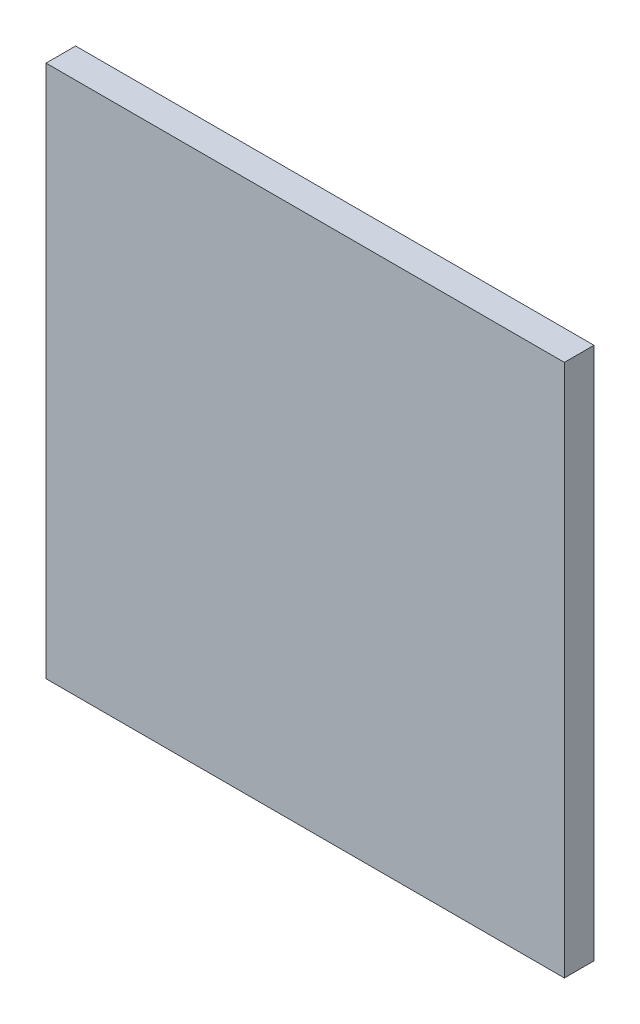
ISO-10303-21;
HEADER;
FILE_DESCRIPTION(('STEP AP214'),'2;1');
FILE_NAME('part.step','',(''),(''),'','','');
FILE_SCHEMA(('AUTOMOTIVE_DESIGN { 1 0 10303 214 1 1 1 1 }'));
ENDSEC;
DATA;
#1=APPLICATION_CONTEXT('core data for automotive mechanical design processes');
#2=APPLICATION_PROTOCOL_DEFINITION('international standard','automotive_design',2000,#1);
#3=PRODUCT_CONTEXT('',#1,'mechanical');
#4=PRODUCT('Part','Part','',(#3));
#5=PRODUCT_RELATED_PRODUCT_CATEGORY('part','',(#4));
#6=PRODUCT_DEFINITION_FORMATION('','',#4);
#7=PRODUCT_DEFINITION_CONTEXT('part definition',#1,'design');
#8=PRODUCT_DEFINITION('design','',#6,#7);
#9=PRODUCT_DEFINITION_SHAPE('','',#8);
#10=(LENGTH_UNIT() NAMED_UNIT(*) SI_UNIT(.MILLI.,.METRE.));
#11=(NAMED_UNIT(*) PLANE_ANGLE_UNIT() SI_UNIT($,.RADIAN.));
#12=(NAMED_UNIT(*) SI_UNIT($,.STERADIAN.) SOLID_ANGLE_UNIT());
#13=UNCERTAINTY_MEASURE_WITH_UNIT(LENGTH_MEASURE(1.E-05),#10,'distance_accuracy_value','');
#14=(GEOMETRIC_REPRESENTATION_CONTEXT(3) GLOBAL_UNCERTAINTY_ASSIGNED_CONTEXT((#13)) GLOBAL_UNIT_ASSIGNED_CONTEXT((#10,
#11,#12)) REPRESENTATION_CONTEXT('',''));
#15=CARTESIAN_POINT('',(0.,0.,0.));
#16=DIRECTION('',(0.,0.,1.));
#17=DIRECTION('',(1.,0.,0.));
#18=AXIS2_PLACEMENT_3D('',#15,#16,#17);
#19=CARTESIAN_POINT('',(17.5,18.,2.));
#20=DIRECTION('',(-1.,0.,0.));
#21=DIRECTION('',(0.,-1.,0.));
#22=AXIS2_PLACEMENT_3D('',#19,#20,#21);
#23=PLANE('',#22);
#24=DIRECTION('',(0.,1.,0.));
#25=VECTOR('',#24,1.);
#26=CARTESIAN_POINT('',(17.5,18.,0.));
#27=LINE('',#26,#25);
#28=CARTESIAN_POINT('',(17.5,-18.,0.));
#29=VERTEX_POINT('',#28);
#30=CARTESIAN_POINT('',(17.5,18.,0.));
#31=VERTEX_POINT('',#30);
#32=EDGE_CURVE('E96',#29,#31,#27,.T.);
#33=ORIENTED_EDGE('',*,*,#32,.T.);
#34=DIRECTION('',(0.,0.,-1.));
#35=VECTOR('',#34,1.);
#36=CARTESIAN_POINT('',(17.5,18.,2.));
#37=LINE('',#36,#35);
#38=CARTESIAN_POINT('',(17.5,18.,2.));
#39=VERTEX_POINT('',#38);
#40=EDGE_CURVE('E11',#39,#31,#37,.T.);
#41=ORIENTED_EDGE('',*,*,#40,.F.);
#42=DIRECTION('',(0.,1.,0.));
#43=VECTOR('',#42,1.);
#44=CARTESIAN_POINT('',(17.5,18.,2.));
#45=LINE('',#44,#43);
#46=CARTESIAN_POINT('',(17.5,-18.,2.));
#47=VERTEX_POINT('',#46);
#48=EDGE_CURVE('E84',#47,#39,#45,.T.);
#49=ORIENTED_EDGE('',*,*,#48,.F.);
#50=DIRECTION('',(0.,0.,-1.));
#51=VECTOR('',#50,1.);
#52=CARTESIAN_POINT('',(17.5,-18.,2.));
#53=LINE('',#52,#51);
#54=EDGE_CURVE('E92',#47,#29,#53,.T.);
#55=ORIENTED_EDGE('',*,*,#54,.T.);
#56=EDGE_LOOP('',(#33,#41,#49,#55));
#57=FACE_BOUND('',#56,.T.);
#58=ADVANCED_FACE('F33',(#57),#23,.F.);
#59=CARTESIAN_POINT('',(-17.5,18.,2.));
#60=DIRECTION('',(0.,-1.,0.));
#61=DIRECTION('',(0.,0.,-1.));
#62=AXIS2_PLACEMENT_3D('',#59,#60,#61);
#63=PLANE('',#62);
#64=DIRECTION('',(-1.,0.,0.));
#65=VECTOR('',#64,1.);
#66=CARTESIAN_POINT('',(-17.5,18.,0.));
#67=LINE('',#66,#65);
#68=CARTESIAN_POINT('',(-17.5,18.,0.));
#69=VERTEX_POINT('',#68);
#70=EDGE_CURVE('E88',#31,#69,#67,.T.);
#71=ORIENTED_EDGE('',*,*,#70,.T.);
#72=DIRECTION('',(0.,0.,-1.));
#73=VECTOR('',#72,1.);
#74=CARTESIAN_POINT('',(-17.5,18.,2.));
#75=LINE('',#74,#73);
#76=CARTESIAN_POINT('',(-17.5,18.,2.));
#77=VERTEX_POINT('',#76);
#78=EDGE_CURVE('E41',#77,#69,#75,.T.);
#79=ORIENTED_EDGE('',*,*,#78,.F.);
#80=DIRECTION('',(-1.,0.,0.));
#81=VECTOR('',#80,1.);
#82=CARTESIAN_POINT('',(-17.5,18.,2.));
#83=LINE('',#82,#81);
#84=EDGE_CURVE('E79',#39,#77,#83,.T.);
#85=ORIENTED_EDGE('',*,*,#84,.F.);
#86=ORIENTED_EDGE('',*,*,#40,.T.);
#87=EDGE_LOOP('',(#71,#79,#85,#86));
#88=FACE_BOUND('',#87,.T.);
#89=ADVANCED_FACE('F87',(#88),#63,.F.);
#90=CARTESIAN_POINT('',(-17.5,18.,2.));
#91=DIRECTION('',(1.,0.,0.));
#92=DIRECTION('',(0.,1.,0.));
#93=AXIS2_PLACEMENT_3D('',#90,#91,#92);
#94=PLANE('',#93);
#95=DIRECTION('',(0.,-1.,0.));
#96=VECTOR('',#95,1.);
#97=CARTESIAN_POINT('',(-17.5,18.,0.));
#98=LINE('',#97,#96);
#99=CARTESIAN_POINT('',(-17.5,-18.,0.));
#100=VERTEX_POINT('',#99);
#101=EDGE_CURVE('E66',#69,#100,#98,.T.);
#102=ORIENTED_EDGE('',*,*,#101,.T.);
#103=DIRECTION('',(0.,0.,-1.));
#104=VECTOR('',#103,1.);
#105=CARTESIAN_POINT('',(-17.5,-18.,2.));
#106=LINE('',#105,#104);
#107=CARTESIAN_POINT('',(-17.5,-18.,2.));
#108=VERTEX_POINT('',#107);
#109=EDGE_CURVE('E89',#108,#100,#106,.T.);
#110=ORIENTED_EDGE('',*,*,#109,.F.);
#111=DIRECTION('',(0.,-1.,0.));
#112=VECTOR('',#111,1.);
#113=CARTESIAN_POINT('',(-17.5,18.,2.));
#114=LINE('',#113,#112);
#115=EDGE_CURVE('E82',#77,#108,#114,.T.);
#116=ORIENTED_EDGE('',*,*,#115,.F.);
#117=ORIENTED_EDGE('',*,*,#78,.T.);
#118=EDGE_LOOP('',(#102,#110,#116,#117));
#119=FACE_BOUND('',#118,.T.);
#120=ADVANCED_FACE('F90',(#119),#94,.F.);
#121=CARTESIAN_POINT('',(-17.5,-18.,2.));
#122=DIRECTION('',(0.,1.,0.));
#123=DIRECTION('',(0.,0.,1.));
#124=AXIS2_PLACEMENT_3D('',#121,#122,#123);
#125=PLANE('',#124);
#126=DIRECTION('',(1.,0.,0.));
#127=VECTOR('',#126,1.);
#128=CARTESIAN_POINT('',(-17.5,-18.,0.));
#129=LINE('',#128,#127);
#130=EDGE_CURVE('E72',#100,#29,#129,.T.);
#131=ORIENTED_EDGE('',*,*,#130,.T.);
#132=ORIENTED_EDGE('',*,*,#54,.F.);
#133=DIRECTION('',(1.,0.,0.));
#134=VECTOR('',#133,1.);
#135=CARTESIAN_POINT('',(-17.5,-18.,2.));
#136=LINE('',#135,#134);
#137=EDGE_CURVE('E49',#108,#47,#136,.T.);
#138=ORIENTED_EDGE('',*,*,#137,.F.);
#139=ORIENTED_EDGE('',*,*,#109,.T.);
#140=EDGE_LOOP('',(#131,#132,#138,#139));
#141=FACE_BOUND('',#140,.T.);
#142=ADVANCED_FACE('F103',(#141),#125,.F.);
#143=CARTESIAN_POINT('',(0.,0.,2.));
#144=DIRECTION('',(0.,0.,1.));
#145=DIRECTION('',(1.,0.,0.));
#146=AXIS2_PLACEMENT_3D('',#143,#144,#145);
#147=PLANE('',#146);
#148=ORIENTED_EDGE('',*,*,#48,.T.);
#149=ORIENTED_EDGE('',*,*,#84,.T.);
#150=ORIENTED_EDGE('',*,*,#115,.T.);
#151=ORIENTED_EDGE('',*,*,#137,.T.);
#152=EDGE_LOOP('',(#148,#149,#150,#151));
#153=FACE_BOUND('',#152,.T.);
#154=ADVANCED_FACE('F80',(#153),#147,.T.);
#155=CARTESIAN_POINT('',(0.,0.,0.));
#156=DIRECTION('',(0.,0.,1.));
#157=DIRECTION('',(1.,0.,0.));
#158=AXIS2_PLACEMENT_3D('',#155,#156,#157);
#159=PLANE('',#158);
#160=ORIENTED_EDGE('',*,*,#32,.F.);
#161=ORIENTED_EDGE('',*,*,#130,.F.);
#162=ORIENTED_EDGE('',*,*,#101,.F.);
#163=ORIENTED_EDGE('',*,*,#70,.F.);
#164=EDGE_LOOP('',(#160,#161,#162,#163));
#165=FACE_BOUND('',#164,.T.);
#166=ADVANCED_FACE('F106',(#165),#159,.F.);
#167=CLOSED_SHELL('',(#58,#89,#120,#142,#154,#166));
#168=MANIFOLD_SOLID_BREP('B2',#167);
#169=ADVANCED_BREP_SHAPE_REPRESENTATION('',(#18,#168),#14);
#170=SHAPE_DEFINITION_REPRESENTATION(#9,#169);
ENDSEC;
END-ISO-10303-21;
